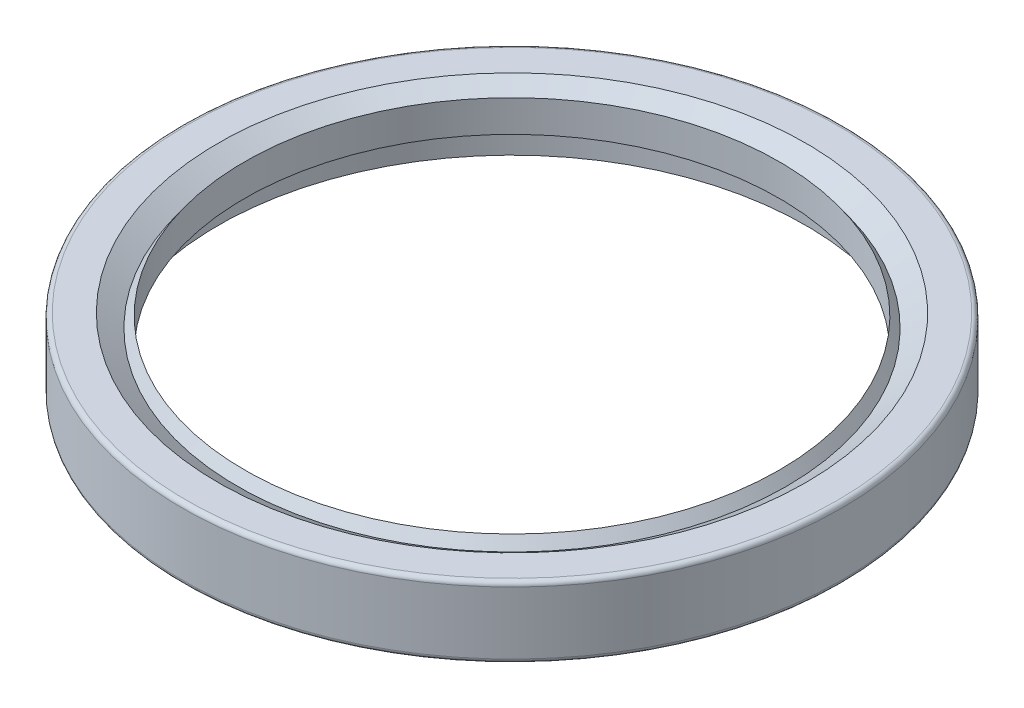
ISO-10303-21;
HEADER;
FILE_DESCRIPTION(('STEP AP214'),'2;1');
FILE_NAME('part.step','',(''),(''),'','','');
FILE_SCHEMA(('AUTOMOTIVE_DESIGN { 1 0 10303 214 1 1 1 1 }'));
ENDSEC;
DATA;
#1=APPLICATION_CONTEXT('core data for automotive mechanical design processes');
#2=APPLICATION_PROTOCOL_DEFINITION('international standard','automotive_design',2000,#1);
#3=PRODUCT_CONTEXT('',#1,'mechanical');
#4=PRODUCT('Part','Part','',(#3));
#5=PRODUCT_RELATED_PRODUCT_CATEGORY('part','',(#4));
#6=PRODUCT_DEFINITION_FORMATION('','',#4);
#7=PRODUCT_DEFINITION_CONTEXT('part definition',#1,'design');
#8=PRODUCT_DEFINITION('design','',#6,#7);
#9=PRODUCT_DEFINITION_SHAPE('','',#8);
#10=(LENGTH_UNIT() NAMED_UNIT(*) SI_UNIT(.MILLI.,.METRE.));
#11=(NAMED_UNIT(*) PLANE_ANGLE_UNIT() SI_UNIT($,.RADIAN.));
#12=(NAMED_UNIT(*) SI_UNIT($,.STERADIAN.) SOLID_ANGLE_UNIT());
#13=UNCERTAINTY_MEASURE_WITH_UNIT(LENGTH_MEASURE(1.E-05),#10,'distance_accuracy_value','');
#14=(GEOMETRIC_REPRESENTATION_CONTEXT(3) GLOBAL_UNCERTAINTY_ASSIGNED_CONTEXT((#13)) GLOBAL_UNIT_ASSIGNED_CONTEXT((#10,
#11,#12)) REPRESENTATION_CONTEXT('',''));
#15=CARTESIAN_POINT('',(0.,0.,0.));
#16=DIRECTION('',(0.,0.,1.));
#17=DIRECTION('',(1.,0.,0.));
#18=AXIS2_PLACEMENT_3D('',#15,#16,#17);
#19=CARTESIAN_POINT('',(0.,0.,0.));
#20=DIRECTION('',(0.,-1.,0.));
#21=DIRECTION('',(1.,0.,0.));
#22=AXIS2_PLACEMENT_3D('',#19,#20,#21);
#23=CYLINDRICAL_SURFACE('',#22,33.);
#24=CARTESIAN_POINT('',(0.,6.15567472929812,0.));
#25=DIRECTION('',(0.,-1.,0.));
#26=DIRECTION('',(1.,0.,0.));
#27=AXIS2_PLACEMENT_3D('',#24,#25,#26);
#28=CIRCLE('',#27,33.);
#29=CARTESIAN_POINT('',(33.,6.15567472929823,0.));
#30=VERTEX_POINT('',#29);
#31=EDGE_CURVE('E10',#30,#30,#28,.T.);
#32=ORIENTED_EDGE('',*,*,#31,.F.);
#33=EDGE_LOOP('',(#32));
#34=FACE_BOUND('',#33,.T.);
#35=CARTESIAN_POINT('',(0.,1.1521895091661E-13,0.));
#36=DIRECTION('',(0.,-1.,0.));
#37=DIRECTION('',(1.,0.,0.));
#38=AXIS2_PLACEMENT_3D('',#35,#36,#37);
#39=CIRCLE('',#38,33.);
#40=CARTESIAN_POINT('',(33.,2.30437901833219E-13,0.));
#41=VERTEX_POINT('',#40);
#42=EDGE_CURVE('E69',#41,#41,#39,.T.);
#43=ORIENTED_EDGE('',*,*,#42,.T.);
#44=EDGE_LOOP('',(#43));
#45=FACE_BOUND('',#44,.T.);
#46=ADVANCED_FACE('F35',(#34,#45),#23,.F.);
#47=CARTESIAN_POINT('',(0.,6.15567472929812,0.));
#48=DIRECTION('',(0.,1.,0.));
#49=DIRECTION('',(-1.,0.,0.));
#50=AXIS2_PLACEMENT_3D('',#47,#48,#49);
#51=CONICAL_SURFACE('',#50,33.,0.980154374076164);
#52=CARTESIAN_POINT('',(0.,4.14421736295819,0.));
#53=DIRECTION('',(0.,-1.,0.));
#54=DIRECTION('',(1.,0.,0.));
#55=AXIS2_PLACEMENT_3D('',#52,#53,#54);
#56=CIRCLE('',#55,30.);
#57=CARTESIAN_POINT('',(30.,4.1442173629583,0.));
#58=VERTEX_POINT('',#57);
#59=EDGE_CURVE('E41',#58,#58,#56,.T.);
#60=ORIENTED_EDGE('',*,*,#59,.F.);
#61=EDGE_LOOP('',(#60));
#62=FACE_BOUND('',#61,.T.);
#63=ORIENTED_EDGE('',*,*,#31,.T.);
#64=EDGE_LOOP('',(#63));
#65=FACE_BOUND('',#64,.T.);
#66=ADVANCED_FACE('F118',(#62,#65),#51,.T.);
#67=CARTESIAN_POINT('',(0.,0.,0.));
#68=DIRECTION('',(0.,-1.,0.));
#69=DIRECTION('',(1.,0.,0.));
#70=AXIS2_PLACEMENT_3D('',#67,#68,#69);
#71=CYLINDRICAL_SURFACE('',#70,30.);
#72=CARTESIAN_POINT('',(0.,7.70796012883178,0.));
#73=DIRECTION('',(0.,-1.,0.));
#74=DIRECTION('',(1.,0.,0.));
#75=AXIS2_PLACEMENT_3D('',#72,#73,#74);
#76=CIRCLE('',#75,30.);
#77=CARTESIAN_POINT('',(29.9999999999999,7.70796012883188,0.));
#78=VERTEX_POINT('',#77);
#79=EDGE_CURVE('E45',#78,#78,#76,.T.);
#80=ORIENTED_EDGE('',*,*,#79,.F.);
#81=EDGE_LOOP('',(#80));
#82=FACE_BOUND('',#81,.T.);
#83=ORIENTED_EDGE('',*,*,#59,.T.);
#84=EDGE_LOOP('',(#83));
#85=FACE_BOUND('',#84,.T.);
#86=ADVANCED_FACE('F113',(#82,#85),#71,.F.);
#87=CARTESIAN_POINT('',(0.,7.70796012883178,0.));
#88=DIRECTION('',(0.,-1.,0.));
#89=DIRECTION('',(1.,0.,0.));
#90=AXIS2_PLACEMENT_3D('',#87,#88,#89);
#91=CONICAL_SURFACE('',#90,30.,0.606474090245753);
#92=CARTESIAN_POINT('',(0.,6.53438034925942,0.));
#93=DIRECTION('',(0.,-1.,0.));
#94=DIRECTION('',(1.,0.,0.));
#95=AXIS2_PLACEMENT_3D('',#92,#93,#94);
#96=CIRCLE('',#95,30.8140928931431);
#97=CARTESIAN_POINT('',(30.8140928931431,6.53438034925952,0.));
#98=VERTEX_POINT('',#97);
#99=EDGE_CURVE('E49',#98,#98,#96,.T.);
#100=ORIENTED_EDGE('',*,*,#99,.F.);
#101=EDGE_LOOP('',(#100));
#102=FACE_BOUND('',#101,.T.);
#103=ORIENTED_EDGE('',*,*,#79,.T.);
#104=EDGE_LOOP('',(#103));
#105=FACE_BOUND('',#104,.T.);
#106=ADVANCED_FACE('F107',(#102,#105),#91,.T.);
#107=CARTESIAN_POINT('',(0.,6.53438034925942,0.));
#108=DIRECTION('',(0.,1.,0.));
#109=DIRECTION('',(-1.,0.,0.));
#110=AXIS2_PLACEMENT_3D('',#107,#108,#109);
#111=CONICAL_SURFACE('',#110,30.8140928931431,0.980154374076164);
#112=CARTESIAN_POINT('',(0.,8.00000000000012,0.));
#113=DIRECTION('',(0.,-1.,0.));
#114=DIRECTION('',(1.,0.,0.));
#115=AXIS2_PLACEMENT_3D('',#112,#113,#114);
#116=CIRCLE('',#115,33.);
#117=CARTESIAN_POINT('',(32.9999999999999,8.00000000000023,0.));
#118=VERTEX_POINT('',#117);
#119=EDGE_CURVE('E54',#118,#118,#116,.T.);
#120=ORIENTED_EDGE('',*,*,#119,.F.);
#121=EDGE_LOOP('',(#120));
#122=FACE_BOUND('',#121,.T.);
#123=ORIENTED_EDGE('',*,*,#99,.T.);
#124=EDGE_LOOP('',(#123));
#125=FACE_BOUND('',#124,.T.);
#126=ADVANCED_FACE('F101',(#122,#125),#111,.F.);
#127=CARTESIAN_POINT('',(-33.,8.00000000000001,0.));
#128=DIRECTION('',(0.,-1.,0.));
#129=DIRECTION('',(1.,0.,0.));
#130=AXIS2_PLACEMENT_3D('',#127,#128,#129);
#131=PLANE('',#130);
#132=CARTESIAN_POINT('',(0.,8.00000000000013,0.));
#133=DIRECTION('',(0.,-1.,0.));
#134=DIRECTION('',(1.,0.,0.));
#135=AXIS2_PLACEMENT_3D('',#132,#133,#134);
#136=CIRCLE('',#135,36.5);
#137=CARTESIAN_POINT('',(36.4999999999999,8.00000000000025,0.));
#138=VERTEX_POINT('',#137);
#139=EDGE_CURVE('E57',#138,#138,#136,.T.);
#140=ORIENTED_EDGE('',*,*,#139,.F.);
#141=EDGE_LOOP('',(#140));
#142=FACE_BOUND('',#141,.T.);
#143=ORIENTED_EDGE('',*,*,#119,.T.);
#144=EDGE_LOOP('',(#143));
#145=FACE_BOUND('',#144,.T.);
#146=ADVANCED_FACE('F95',(#142,#145),#131,.F.);
#147=CARTESIAN_POINT('',(0.,7.50000000000013,0.));
#148=DIRECTION('',(0.,-1.,0.));
#149=DIRECTION('',(1.,0.,0.));
#150=AXIS2_PLACEMENT_3D('',#147,#148,#149);
#151=TOROIDAL_SURFACE('',#150,36.5,0.5);
#152=CARTESIAN_POINT('',(0.,7.50000000000013,0.));
#153=DIRECTION('',(0.,-1.,0.));
#154=DIRECTION('',(1.,0.,0.));
#155=AXIS2_PLACEMENT_3D('',#152,#153,#154);
#156=CIRCLE('',#155,37.);
#157=CARTESIAN_POINT('',(36.9999999999999,7.50000000000026,0.));
#158=VERTEX_POINT('',#157);
#159=EDGE_CURVE('E60',#158,#158,#156,.T.);
#160=ORIENTED_EDGE('',*,*,#159,.F.);
#161=EDGE_LOOP('',(#160));
#162=FACE_BOUND('',#161,.T.);
#163=ORIENTED_EDGE('',*,*,#139,.T.);
#164=EDGE_LOOP('',(#163));
#165=FACE_BOUND('',#164,.T.);
#166=ADVANCED_FACE('F89',(#162,#165),#151,.T.);
#167=CARTESIAN_POINT('',(0.,0.,0.));
#168=DIRECTION('',(0.,-1.,0.));
#169=DIRECTION('',(1.,0.,0.));
#170=AXIS2_PLACEMENT_3D('',#167,#168,#169);
#171=CYLINDRICAL_SURFACE('',#170,37.);
#172=CARTESIAN_POINT('',(0.,0.500000000000132,0.));
#173=DIRECTION('',(0.,-1.,0.));
#174=DIRECTION('',(1.,0.,0.));
#175=AXIS2_PLACEMENT_3D('',#172,#173,#174);
#176=CIRCLE('',#175,37.);
#177=CARTESIAN_POINT('',(37.,0.500000000000262,0.));
#178=VERTEX_POINT('',#177);
#179=EDGE_CURVE('E63',#178,#178,#176,.T.);
#180=ORIENTED_EDGE('',*,*,#179,.F.);
#181=EDGE_LOOP('',(#180));
#182=FACE_BOUND('',#181,.T.);
#183=ORIENTED_EDGE('',*,*,#159,.T.);
#184=EDGE_LOOP('',(#183));
#185=FACE_BOUND('',#184,.T.);
#186=ADVANCED_FACE('F83',(#182,#185),#171,.T.);
#187=CARTESIAN_POINT('',(0.,0.500000000000127,0.));
#188=DIRECTION('',(0.,-1.,0.));
#189=DIRECTION('',(1.,0.,0.));
#190=AXIS2_PLACEMENT_3D('',#187,#188,#189);
#191=TOROIDAL_SURFACE('',#190,36.5,0.5);
#192=CARTESIAN_POINT('',(0.,1.27117672895716E-13,0.));
#193=DIRECTION('',(0.,-1.,0.));
#194=DIRECTION('',(1.,0.,0.));
#195=AXIS2_PLACEMENT_3D('',#192,#193,#194);
#196=CIRCLE('',#195,36.5);
#197=CARTESIAN_POINT('',(36.5,2.54556815576209E-13,0.));
#198=VERTEX_POINT('',#197);
#199=EDGE_CURVE('E66',#198,#198,#196,.T.);
#200=ORIENTED_EDGE('',*,*,#199,.F.);
#201=EDGE_LOOP('',(#200));
#202=FACE_BOUND('',#201,.T.);
#203=ORIENTED_EDGE('',*,*,#179,.T.);
#204=EDGE_LOOP('',(#203));
#205=FACE_BOUND('',#204,.T.);
#206=ADVANCED_FACE('F77',(#202,#205),#191,.T.);
#207=CARTESIAN_POINT('',(-33.,0.,0.));
#208=DIRECTION('',(0.,1.,0.));
#209=DIRECTION('',(-1.,0.,0.));
#210=AXIS2_PLACEMENT_3D('',#207,#208,#209);
#211=PLANE('',#210);
#212=ORIENTED_EDGE('',*,*,#42,.F.);
#213=EDGE_LOOP('',(#212));
#214=FACE_BOUND('',#213,.T.);
#215=ORIENTED_EDGE('',*,*,#199,.T.);
#216=EDGE_LOOP('',(#215));
#217=FACE_BOUND('',#216,.T.);
#218=ADVANCED_FACE('F74',(#214,#217),#211,.F.);
#219=CLOSED_SHELL('',(#46,#66,#86,#106,#126,#146,#166,#186,#206,#218));
#220=MANIFOLD_SOLID_BREP('B2',#219);
#221=ADVANCED_BREP_SHAPE_REPRESENTATION('',(#18,#220),#14);
#222=SHAPE_DEFINITION_REPRESENTATION(#9,#221);
ENDSEC;
END-ISO-10303-21;
